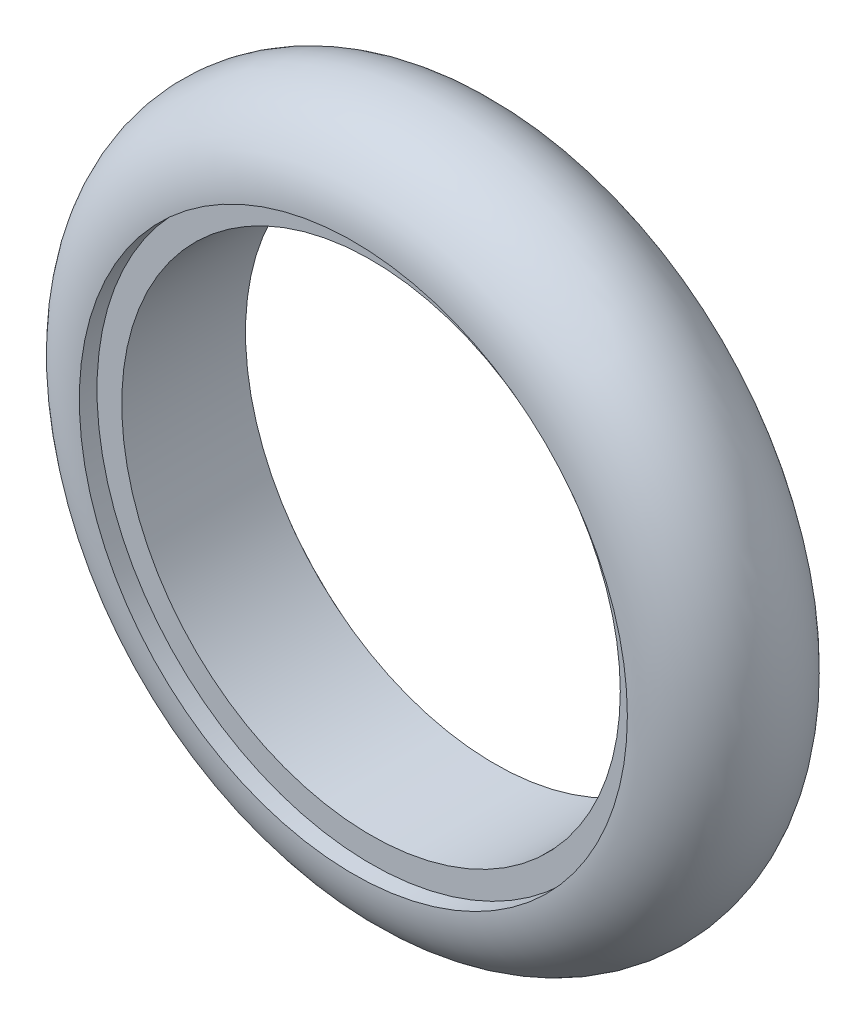
ISO-10303-21;
HEADER;
FILE_DESCRIPTION(('STEP AP214'),'2;1');
FILE_NAME('part.step','',(''),(''),'','','');
FILE_SCHEMA(('AUTOMOTIVE_DESIGN { 1 0 10303 214 1 1 1 1 }'));
ENDSEC;
DATA;
#1=APPLICATION_CONTEXT('core data for automotive mechanical design processes');
#2=APPLICATION_PROTOCOL_DEFINITION('international standard','automotive_design',2000,#1);
#3=PRODUCT_CONTEXT('',#1,'mechanical');
#4=PRODUCT('Part','Part','',(#3));
#5=PRODUCT_RELATED_PRODUCT_CATEGORY('part','',(#4));
#6=PRODUCT_DEFINITION_FORMATION('','',#4);
#7=PRODUCT_DEFINITION_CONTEXT('part definition',#1,'design');
#8=PRODUCT_DEFINITION('design','',#6,#7);
#9=PRODUCT_DEFINITION_SHAPE('','',#8);
#10=(LENGTH_UNIT() NAMED_UNIT(*) SI_UNIT(.MILLI.,.METRE.));
#11=(NAMED_UNIT(*) PLANE_ANGLE_UNIT() SI_UNIT($,.RADIAN.));
#12=(NAMED_UNIT(*) SI_UNIT($,.STERADIAN.) SOLID_ANGLE_UNIT());
#13=UNCERTAINTY_MEASURE_WITH_UNIT(LENGTH_MEASURE(1.E-05),#10,'distance_accuracy_value','');
#14=(GEOMETRIC_REPRESENTATION_CONTEXT(3) GLOBAL_UNCERTAINTY_ASSIGNED_CONTEXT((#13)) GLOBAL_UNIT_ASSIGNED_CONTEXT((#10,
#11,#12)) REPRESENTATION_CONTEXT('',''));
#15=CARTESIAN_POINT('',(0.,0.,0.));
#16=DIRECTION('',(0.,0.,1.));
#17=DIRECTION('',(1.,0.,0.));
#18=AXIS2_PLACEMENT_3D('',#15,#16,#17);
#19=CARTESIAN_POINT('',(0.,0.,0.));
#20=DIRECTION('',(0.,0.,1.));
#21=DIRECTION('',(1.,0.,0.));
#22=AXIS2_PLACEMENT_3D('',#19,#20,#21);
#23=TOROIDAL_SURFACE('',#22,77.5,22.5);
#24=CARTESIAN_POINT('',(0.,0.,22.5));
#25=DIRECTION('',(0.,0.,1.));
#26=DIRECTION('',(1.,0.,0.));
#27=AXIS2_PLACEMENT_3D('',#24,#25,#26);
#28=CIRCLE('',#27,77.5);
#29=CARTESIAN_POINT('',(77.5,0.,22.5));
#30=VERTEX_POINT('',#29);
#31=EDGE_CURVE('E54',#30,#30,#28,.T.);
#32=ORIENTED_EDGE('',*,*,#31,.F.);
#33=EDGE_LOOP('',(#32));
#34=FACE_BOUND('',#33,.T.);
#35=CARTESIAN_POINT('',(0.,0.,-22.5));
#36=DIRECTION('',(0.,0.,1.));
#37=DIRECTION('',(1.,0.,0.));
#38=AXIS2_PLACEMENT_3D('',#35,#36,#37);
#39=CIRCLE('',#38,77.5);
#40=CARTESIAN_POINT('',(77.5,0.,-22.5));
#41=VERTEX_POINT('',#40);
#42=EDGE_CURVE('E10',#41,#41,#39,.T.);
#43=ORIENTED_EDGE('',*,*,#42,.T.);
#44=EDGE_LOOP('',(#43));
#45=FACE_BOUND('',#44,.T.);
#46=ADVANCED_FACE('F32',(#34,#45),#23,.T.);
#47=CARTESIAN_POINT('',(0.,0.,0.));
#48=DIRECTION('',(0.,0.,1.));
#49=DIRECTION('',(1.,0.,0.));
#50=AXIS2_PLACEMENT_3D('',#47,#48,#49);
#51=CYLINDRICAL_SURFACE('',#50,77.5);
#52=ORIENTED_EDGE('',*,*,#42,.F.);
#53=EDGE_LOOP('',(#52));
#54=FACE_BOUND('',#53,.T.);
#55=CARTESIAN_POINT('',(0.,0.,-17.5));
#56=DIRECTION('',(0.,0.,1.));
#57=DIRECTION('',(1.,0.,0.));
#58=AXIS2_PLACEMENT_3D('',#55,#56,#57);
#59=CIRCLE('',#58,77.5);
#60=CARTESIAN_POINT('',(77.5,0.,-17.5));
#61=VERTEX_POINT('',#60);
#62=EDGE_CURVE('E38',#61,#61,#59,.T.);
#63=ORIENTED_EDGE('',*,*,#62,.T.);
#64=EDGE_LOOP('',(#63));
#65=FACE_BOUND('',#64,.T.);
#66=ADVANCED_FACE('F61',(#54,#65),#51,.F.);
#67=CARTESIAN_POINT('',(0.,70.5,-17.5));
#68=DIRECTION('',(0.,0.,1.));
#69=DIRECTION('',(1.,0.,0.));
#70=AXIS2_PLACEMENT_3D('',#67,#68,#69);
#71=PLANE('',#70);
#72=ORIENTED_EDGE('',*,*,#62,.F.);
#73=EDGE_LOOP('',(#72));
#74=FACE_BOUND('',#73,.T.);
#75=CARTESIAN_POINT('',(0.,0.,-17.5));
#76=DIRECTION('',(0.,0.,1.));
#77=DIRECTION('',(1.,0.,0.));
#78=AXIS2_PLACEMENT_3D('',#75,#76,#77);
#79=CIRCLE('',#78,70.5);
#80=CARTESIAN_POINT('',(70.5,0.,-17.5));
#81=VERTEX_POINT('',#80);
#82=EDGE_CURVE('E42',#81,#81,#79,.T.);
#83=ORIENTED_EDGE('',*,*,#82,.T.);
#84=EDGE_LOOP('',(#83));
#85=FACE_BOUND('',#84,.T.);
#86=ADVANCED_FACE('F65',(#74,#85),#71,.F.);
#87=CARTESIAN_POINT('',(0.,0.,0.));
#88=DIRECTION('',(0.,0.,1.));
#89=DIRECTION('',(1.,0.,0.));
#90=AXIS2_PLACEMENT_3D('',#87,#88,#89);
#91=CYLINDRICAL_SURFACE('',#90,70.5);
#92=ORIENTED_EDGE('',*,*,#82,.F.);
#93=EDGE_LOOP('',(#92));
#94=FACE_BOUND('',#93,.T.);
#95=CARTESIAN_POINT('',(0.,0.,17.5));
#96=DIRECTION('',(0.,0.,1.));
#97=DIRECTION('',(1.,0.,0.));
#98=AXIS2_PLACEMENT_3D('',#95,#96,#97);
#99=CIRCLE('',#98,70.5);
#100=CARTESIAN_POINT('',(70.5,0.,17.5));
#101=VERTEX_POINT('',#100);
#102=EDGE_CURVE('E46',#101,#101,#99,.T.);
#103=ORIENTED_EDGE('',*,*,#102,.T.);
#104=EDGE_LOOP('',(#103));
#105=FACE_BOUND('',#104,.T.);
#106=ADVANCED_FACE('F70',(#94,#105),#91,.F.);
#107=CARTESIAN_POINT('',(0.,77.5,17.5));
#108=DIRECTION('',(0.,0.,-1.));
#109=DIRECTION('',(-1.,0.,0.));
#110=AXIS2_PLACEMENT_3D('',#107,#108,#109);
#111=PLANE('',#110);
#112=ORIENTED_EDGE('',*,*,#102,.F.);
#113=EDGE_LOOP('',(#112));
#114=FACE_BOUND('',#113,.T.);
#115=CARTESIAN_POINT('',(0.,0.,17.5));
#116=DIRECTION('',(0.,0.,1.));
#117=DIRECTION('',(1.,0.,0.));
#118=AXIS2_PLACEMENT_3D('',#115,#116,#117);
#119=CIRCLE('',#118,77.5);
#120=CARTESIAN_POINT('',(77.5,0.,17.5));
#121=VERTEX_POINT('',#120);
#122=EDGE_CURVE('E51',#121,#121,#119,.T.);
#123=ORIENTED_EDGE('',*,*,#122,.T.);
#124=EDGE_LOOP('',(#123));
#125=FACE_BOUND('',#124,.T.);
#126=ADVANCED_FACE('F76',(#114,#125),#111,.F.);
#127=CARTESIAN_POINT('',(0.,0.,0.));
#128=DIRECTION('',(0.,0.,1.));
#129=DIRECTION('',(1.,0.,0.));
#130=AXIS2_PLACEMENT_3D('',#127,#128,#129);
#131=CYLINDRICAL_SURFACE('',#130,77.5);
#132=ORIENTED_EDGE('',*,*,#122,.F.);
#133=EDGE_LOOP('',(#132));
#134=FACE_BOUND('',#133,.T.);
#135=ORIENTED_EDGE('',*,*,#31,.T.);
#136=EDGE_LOOP('',(#135));
#137=FACE_BOUND('',#136,.T.);
#138=ADVANCED_FACE('F58',(#134,#137),#131,.F.);
#139=CLOSED_SHELL('',(#46,#66,#86,#106,#126,#138));
#140=MANIFOLD_SOLID_BREP('B2',#139);
#141=ADVANCED_BREP_SHAPE_REPRESENTATION('',(#18,#140),#14);
#142=SHAPE_DEFINITION_REPRESENTATION(#9,#141);
ENDSEC;
END-ISO-10303-21;
